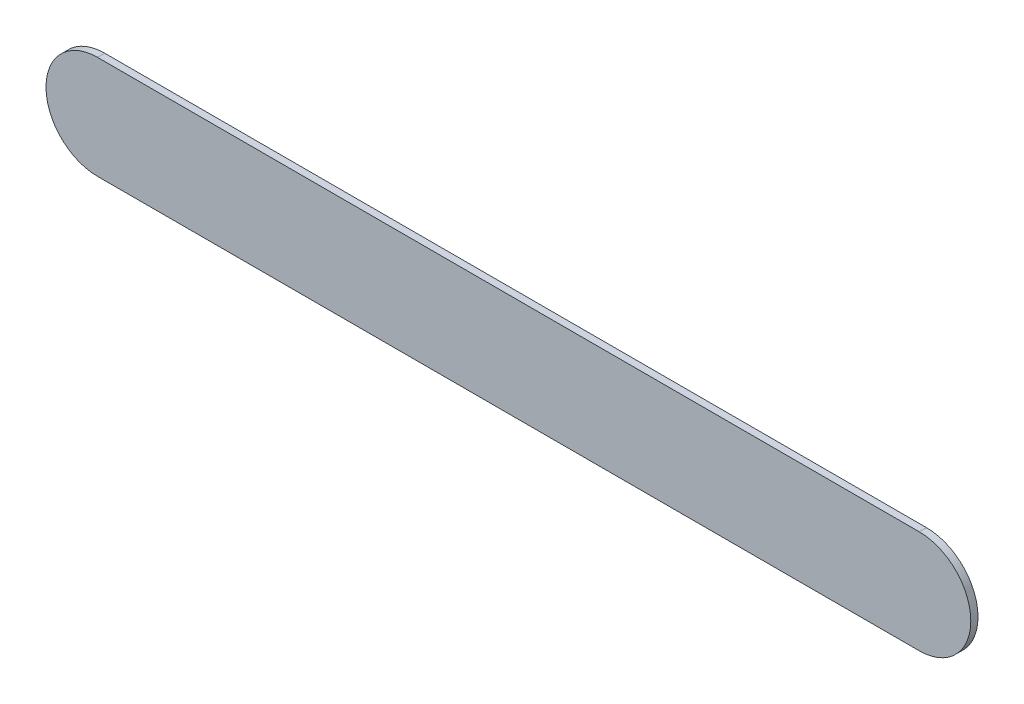
ISO-10303-21;
HEADER;
FILE_DESCRIPTION(('STEP AP214'),'2;1');
FILE_NAME('part.step','',(''),(''),'','','');
FILE_SCHEMA(('AUTOMOTIVE_DESIGN { 1 0 10303 214 1 1 1 1 }'));
ENDSEC;
DATA;
#1=APPLICATION_CONTEXT('core data for automotive mechanical design processes');
#2=APPLICATION_PROTOCOL_DEFINITION('international standard','automotive_design',2000,#1);
#3=PRODUCT_CONTEXT('',#1,'mechanical');
#4=PRODUCT('Part','Part','',(#3));
#5=PRODUCT_RELATED_PRODUCT_CATEGORY('part','',(#4));
#6=PRODUCT_DEFINITION_FORMATION('','',#4);
#7=PRODUCT_DEFINITION_CONTEXT('part definition',#1,'design');
#8=PRODUCT_DEFINITION('design','',#6,#7);
#9=PRODUCT_DEFINITION_SHAPE('','',#8);
#10=(LENGTH_UNIT() NAMED_UNIT(*) SI_UNIT(.MILLI.,.METRE.));
#11=(NAMED_UNIT(*) PLANE_ANGLE_UNIT() SI_UNIT($,.RADIAN.));
#12=(NAMED_UNIT(*) SI_UNIT($,.STERADIAN.) SOLID_ANGLE_UNIT());
#13=UNCERTAINTY_MEASURE_WITH_UNIT(LENGTH_MEASURE(1.E-05),#10,'distance_accuracy_value','');
#14=(GEOMETRIC_REPRESENTATION_CONTEXT(3) GLOBAL_UNCERTAINTY_ASSIGNED_CONTEXT((#13)) GLOBAL_UNIT_ASSIGNED_CONTEXT((#10,
#11,#12)) REPRESENTATION_CONTEXT('',''));
#15=CARTESIAN_POINT('',(0.,0.,0.));
#16=DIRECTION('',(0.,0.,1.));
#17=DIRECTION('',(1.,0.,0.));
#18=AXIS2_PLACEMENT_3D('',#15,#16,#17);
#19=CARTESIAN_POINT('',(114.983501,-72.103501,1.635));
#20=DIRECTION('',(0.,0.,1.));
#21=DIRECTION('',(1.,0.,0.));
#22=AXIS2_PLACEMENT_3D('',#19,#20,#21);
#23=PLANE('',#22);
#24=DIRECTION('',(1.,0.,0.));
#25=VECTOR('',#24,1.);
#26=CARTESIAN_POINT('',(114.983501,-72.103501,1.635));
#27=LINE('',#26,#25);
#28=CARTESIAN_POINT('',(114.983501,-72.103501,1.635));
#29=VERTEX_POINT('',#28);
#30=CARTESIAN_POINT('',(118.97,-72.103501,1.635));
#31=VERTEX_POINT('',#30);
#32=EDGE_CURVE('E85',#29,#31,#27,.T.);
#33=ORIENTED_EDGE('',*,*,#32,.T.);
#34=CARTESIAN_POINT('',(118.97,-71.853501,1.635));
#35=DIRECTION('',(0.,0.,1.));
#36=DIRECTION('',(0.,-1.,0.));
#37=AXIS2_PLACEMENT_3D('',#34,#35,#36);
#38=CIRCLE('',#37,0.25);
#39=CARTESIAN_POINT('',(118.97,-71.603501,1.635));
#40=VERTEX_POINT('',#39);
#41=EDGE_CURVE('E71',#31,#40,#38,.T.);
#42=ORIENTED_EDGE('',*,*,#41,.T.);
#43=DIRECTION('',(-1.,0.,0.));
#44=VECTOR('',#43,1.);
#45=CARTESIAN_POINT('',(118.97,-71.603501,1.635));
#46=LINE('',#45,#44);
#47=CARTESIAN_POINT('',(114.983501,-71.603501,1.635));
#48=VERTEX_POINT('',#47);
#49=EDGE_CURVE('E102',#40,#48,#46,.T.);
#50=ORIENTED_EDGE('',*,*,#49,.T.);
#51=CARTESIAN_POINT('',(114.983501,-71.853501,1.635));
#52=DIRECTION('',(0.,0.,1.));
#53=DIRECTION('',(0.,1.,0.));
#54=AXIS2_PLACEMENT_3D('',#51,#52,#53);
#55=CIRCLE('',#54,0.25);
#56=EDGE_CURVE('E11',#48,#29,#55,.T.);
#57=ORIENTED_EDGE('',*,*,#56,.T.);
#58=EDGE_LOOP('',(#33,#42,#50,#57));
#59=FACE_BOUND('',#58,.T.);
#60=ADVANCED_FACE('F17',(#59),#23,.T.);
#61=CARTESIAN_POINT('',(114.983501,-72.103501,1.6));
#62=DIRECTION('',(0.,0.,1.));
#63=DIRECTION('',(1.,0.,0.));
#64=AXIS2_PLACEMENT_3D('',#61,#62,#63);
#65=PLANE('',#64);
#66=CARTESIAN_POINT('',(114.983501,-71.853501,1.6));
#67=DIRECTION('',(0.,0.,1.));
#68=DIRECTION('',(0.,1.,0.));
#69=AXIS2_PLACEMENT_3D('',#66,#67,#68);
#70=CIRCLE('',#69,0.25);
#71=CARTESIAN_POINT('',(114.983501,-71.603501,1.6));
#72=VERTEX_POINT('',#71);
#73=CARTESIAN_POINT('',(114.983501,-72.103501,1.6));
#74=VERTEX_POINT('',#73);
#75=EDGE_CURVE('E26',#72,#74,#70,.T.);
#76=ORIENTED_EDGE('',*,*,#75,.F.);
#77=DIRECTION('',(-1.,0.,0.));
#78=VECTOR('',#77,1.);
#79=CARTESIAN_POINT('',(118.97,-71.603501,1.6));
#80=LINE('',#79,#78);
#81=CARTESIAN_POINT('',(118.97,-71.603501,1.6));
#82=VERTEX_POINT('',#81);
#83=EDGE_CURVE('E82',#82,#72,#80,.T.);
#84=ORIENTED_EDGE('',*,*,#83,.F.);
#85=CARTESIAN_POINT('',(118.97,-71.853501,1.6));
#86=DIRECTION('',(0.,0.,1.));
#87=DIRECTION('',(0.,-1.,0.));
#88=AXIS2_PLACEMENT_3D('',#85,#86,#87);
#89=CIRCLE('',#88,0.25);
#90=CARTESIAN_POINT('',(118.97,-72.103501,1.6));
#91=VERTEX_POINT('',#90);
#92=EDGE_CURVE('E108',#91,#82,#89,.T.);
#93=ORIENTED_EDGE('',*,*,#92,.F.);
#94=DIRECTION('',(1.,0.,0.));
#95=VECTOR('',#94,1.);
#96=CARTESIAN_POINT('',(114.983501,-72.103501,1.6));
#97=LINE('',#96,#95);
#98=EDGE_CURVE('E92',#74,#91,#97,.T.);
#99=ORIENTED_EDGE('',*,*,#98,.F.);
#100=EDGE_LOOP('',(#76,#84,#93,#99));
#101=FACE_BOUND('',#100,.T.);
#102=ADVANCED_FACE('F19',(#101),#65,.F.);
#103=CARTESIAN_POINT('',(114.983501,-71.853501,1.6));
#104=DIRECTION('',(0.,0.,-1.));
#105=DIRECTION('',(0.,1.,0.));
#106=AXIS2_PLACEMENT_3D('',#103,#104,#105);
#107=CYLINDRICAL_SURFACE('',#106,0.25);
#108=ORIENTED_EDGE('',*,*,#75,.T.);
#109=DIRECTION('',(0.,0.,1.));
#110=VECTOR('',#109,1.);
#111=CARTESIAN_POINT('',(114.983501,-72.103501,1.6));
#112=LINE('',#111,#110);
#113=EDGE_CURVE('E89',#74,#29,#112,.T.);
#114=ORIENTED_EDGE('',*,*,#113,.T.);
#115=ORIENTED_EDGE('',*,*,#56,.F.);
#116=DIRECTION('',(0.,0.,1.));
#117=VECTOR('',#116,1.);
#118=CARTESIAN_POINT('',(114.983501,-71.603501,1.6));
#119=LINE('',#118,#117);
#120=EDGE_CURVE('E105',#72,#48,#119,.T.);
#121=ORIENTED_EDGE('',*,*,#120,.F.);
#122=EDGE_LOOP('',(#108,#114,#115,#121));
#123=FACE_BOUND('',#122,.T.);
#124=ADVANCED_FACE('F119',(#123),#107,.T.);
#125=CARTESIAN_POINT('',(118.97,-71.603501,1.6));
#126=DIRECTION('',(0.,-1.,0.));
#127=DIRECTION('',(0.,0.,-1.));
#128=AXIS2_PLACEMENT_3D('',#125,#126,#127);
#129=PLANE('',#128);
#130=ORIENTED_EDGE('',*,*,#83,.T.);
#131=ORIENTED_EDGE('',*,*,#120,.T.);
#132=ORIENTED_EDGE('',*,*,#49,.F.);
#133=DIRECTION('',(0.,0.,1.));
#134=VECTOR('',#133,1.);
#135=CARTESIAN_POINT('',(118.97,-71.603501,1.6));
#136=LINE('',#135,#134);
#137=EDGE_CURVE('E79',#82,#40,#136,.T.);
#138=ORIENTED_EDGE('',*,*,#137,.F.);
#139=EDGE_LOOP('',(#130,#131,#132,#138));
#140=FACE_BOUND('',#139,.T.);
#141=ADVANCED_FACE('F121',(#140),#129,.F.);
#142=CARTESIAN_POINT('',(118.97,-71.853501,1.6));
#143=DIRECTION('',(0.,0.,-1.));
#144=DIRECTION('',(0.,-1.,0.));
#145=AXIS2_PLACEMENT_3D('',#142,#143,#144);
#146=CYLINDRICAL_SURFACE('',#145,0.25);
#147=ORIENTED_EDGE('',*,*,#92,.T.);
#148=ORIENTED_EDGE('',*,*,#137,.T.);
#149=ORIENTED_EDGE('',*,*,#41,.F.);
#150=DIRECTION('',(0.,0.,1.));
#151=VECTOR('',#150,1.);
#152=CARTESIAN_POINT('',(118.97,-72.103501,1.6));
#153=LINE('',#152,#151);
#154=EDGE_CURVE('E76',#91,#31,#153,.T.);
#155=ORIENTED_EDGE('',*,*,#154,.F.);
#156=EDGE_LOOP('',(#147,#148,#149,#155));
#157=FACE_BOUND('',#156,.T.);
#158=ADVANCED_FACE('F74',(#157),#146,.T.);
#159=CARTESIAN_POINT('',(114.983501,-72.103501,1.6));
#160=DIRECTION('',(0.,1.,0.));
#161=DIRECTION('',(1.,0.,0.));
#162=AXIS2_PLACEMENT_3D('',#159,#160,#161);
#163=PLANE('',#162);
#164=ORIENTED_EDGE('',*,*,#98,.T.);
#165=ORIENTED_EDGE('',*,*,#154,.T.);
#166=ORIENTED_EDGE('',*,*,#32,.F.);
#167=ORIENTED_EDGE('',*,*,#113,.F.);
#168=EDGE_LOOP('',(#164,#165,#166,#167));
#169=FACE_BOUND('',#168,.T.);
#170=ADVANCED_FACE('F91',(#169),#163,.F.);
#171=CLOSED_SHELL('',(#60,#102,#124,#141,#158,#170));
#172=MANIFOLD_SOLID_BREP('B1',#171);
#173=ADVANCED_BREP_SHAPE_REPRESENTATION('',(#18,#172),#14);
#174=SHAPE_DEFINITION_REPRESENTATION(#9,#173);
ENDSEC;
END-ISO-10303-21;
